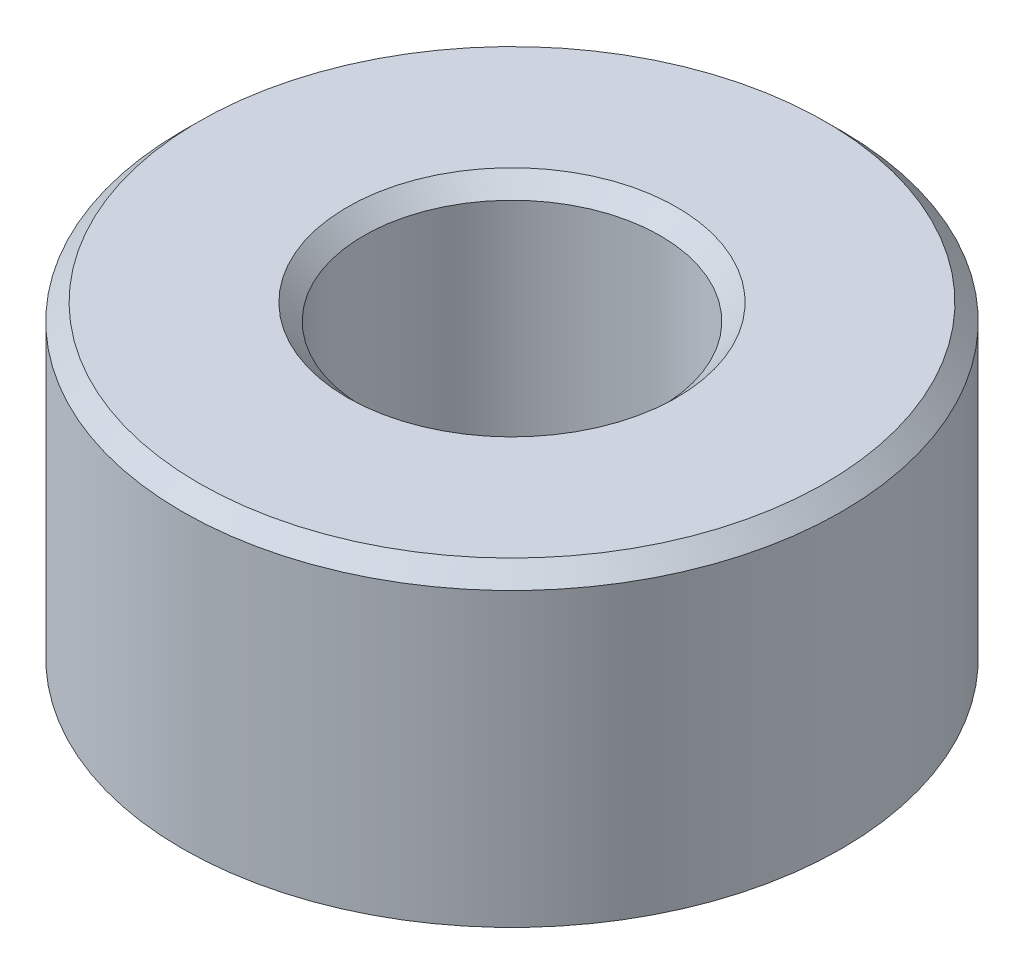
ISO-10303-21;
HEADER;
FILE_DESCRIPTION(('STEP AP214'),'2;1');
FILE_NAME('part.step','',(''),(''),'','','');
FILE_SCHEMA(('AUTOMOTIVE_DESIGN { 1 0 10303 214 1 1 1 1 }'));
ENDSEC;
DATA;
#1=APPLICATION_CONTEXT('core data for automotive mechanical design processes');
#2=APPLICATION_PROTOCOL_DEFINITION('international standard','automotive_design',2000,#1);
#3=PRODUCT_CONTEXT('',#1,'mechanical');
#4=PRODUCT('Part','Part','',(#3));
#5=PRODUCT_RELATED_PRODUCT_CATEGORY('part','',(#4));
#6=PRODUCT_DEFINITION_FORMATION('','',#4);
#7=PRODUCT_DEFINITION_CONTEXT('part definition',#1,'design');
#8=PRODUCT_DEFINITION('design','',#6,#7);
#9=PRODUCT_DEFINITION_SHAPE('','',#8);
#10=(LENGTH_UNIT() NAMED_UNIT(*) SI_UNIT(.MILLI.,.METRE.));
#11=(NAMED_UNIT(*) PLANE_ANGLE_UNIT() SI_UNIT($,.RADIAN.));
#12=(NAMED_UNIT(*) SI_UNIT($,.STERADIAN.) SOLID_ANGLE_UNIT());
#13=UNCERTAINTY_MEASURE_WITH_UNIT(LENGTH_MEASURE(1.E-05),#10,'distance_accuracy_value','');
#14=(GEOMETRIC_REPRESENTATION_CONTEXT(3) GLOBAL_UNCERTAINTY_ASSIGNED_CONTEXT((#13)) GLOBAL_UNIT_ASSIGNED_CONTEXT((#10,
#11,#12)) REPRESENTATION_CONTEXT('',''));
#15=CARTESIAN_POINT('',(0.,0.,0.));
#16=DIRECTION('',(0.,0.,1.));
#17=DIRECTION('',(1.,0.,0.));
#18=AXIS2_PLACEMENT_3D('',#15,#16,#17);
#19=CARTESIAN_POINT('',(0.,9.35,0.));
#20=DIRECTION('',(0.,1.,0.));
#21=DIRECTION('',(0.,0.,1.));
#22=AXIS2_PLACEMENT_3D('',#19,#20,#21);
#23=PLANE('',#22);
#24=CARTESIAN_POINT('',(0.,9.35,0.));
#25=DIRECTION('',(0.,1.,0.));
#26=DIRECTION('',(0.,0.,1.));
#27=AXIS2_PLACEMENT_3D('',#24,#25,#26);
#28=CIRCLE('',#27,9.50000000000001);
#29=CARTESIAN_POINT('',(0.,9.35,9.50000000000001));
#30=VERTEX_POINT('',#29);
#31=EDGE_CURVE('E45',#30,#30,#28,.T.);
#32=ORIENTED_EDGE('',*,*,#31,.T.);
#33=EDGE_LOOP('',(#32));
#34=FACE_BOUND('',#33,.T.);
#35=CARTESIAN_POINT('',(0.,9.35,0.));
#36=DIRECTION('',(0.,1.,0.));
#37=DIRECTION('',(0.,0.,1.));
#38=AXIS2_PLACEMENT_3D('',#35,#36,#37);
#39=CIRCLE('',#38,5.);
#40=CARTESIAN_POINT('',(0.,9.35,5.));
#41=VERTEX_POINT('',#40);
#42=EDGE_CURVE('E49',#41,#41,#39,.F.);
#43=ORIENTED_EDGE('',*,*,#42,.T.);
#44=EDGE_LOOP('',(#43));
#45=FACE_BOUND('',#44,.T.);
#46=ADVANCED_FACE('F34',(#34,#45),#23,.T.);
#47=CARTESIAN_POINT('',(0.,0.,0.));
#48=DIRECTION('',(0.,1.,0.));
#49=DIRECTION('',(0.,0.,1.));
#50=AXIS2_PLACEMENT_3D('',#47,#48,#49);
#51=PLANE('',#50);
#52=CARTESIAN_POINT('',(0.,0.,0.));
#53=DIRECTION('',(0.,1.,0.));
#54=DIRECTION('',(0.,0.,1.));
#55=AXIS2_PLACEMENT_3D('',#52,#53,#54);
#56=CIRCLE('',#55,10.);
#57=CARTESIAN_POINT('',(0.,0.,10.));
#58=VERTEX_POINT('',#57);
#59=EDGE_CURVE('E54',#58,#58,#56,.T.);
#60=ORIENTED_EDGE('',*,*,#59,.F.);
#61=EDGE_LOOP('',(#60));
#62=FACE_BOUND('',#61,.T.);
#63=CARTESIAN_POINT('',(0.,0.,0.));
#64=DIRECTION('',(0.,1.,0.));
#65=DIRECTION('',(0.,0.,1.));
#66=AXIS2_PLACEMENT_3D('',#63,#64,#65);
#67=CIRCLE('',#66,4.5);
#68=CARTESIAN_POINT('',(0.,0.,4.5));
#69=VERTEX_POINT('',#68);
#70=EDGE_CURVE('E57',#69,#69,#67,.T.);
#71=ORIENTED_EDGE('',*,*,#70,.T.);
#72=EDGE_LOOP('',(#71));
#73=FACE_BOUND('',#72,.T.);
#74=ADVANCED_FACE('F61',(#62,#73),#51,.F.);
#75=CARTESIAN_POINT('',(0.,9.35,0.));
#76=DIRECTION('',(0.,-1.,0.));
#77=DIRECTION('',(0.,0.,-1.));
#78=AXIS2_PLACEMENT_3D('',#75,#76,#77);
#79=CYLINDRICAL_SURFACE('',#78,10.);
#80=CARTESIAN_POINT('',(0.,8.85,0.));
#81=DIRECTION('',(0.,1.,0.));
#82=DIRECTION('',(0.,0.,1.));
#83=AXIS2_PLACEMENT_3D('',#80,#81,#82);
#84=CIRCLE('',#83,10.);
#85=CARTESIAN_POINT('',(0.,8.85,10.));
#86=VERTEX_POINT('',#85);
#87=EDGE_CURVE('E41',#86,#86,#84,.F.);
#88=ORIENTED_EDGE('',*,*,#87,.T.);
#89=EDGE_LOOP('',(#88));
#90=FACE_BOUND('',#89,.T.);
#91=ORIENTED_EDGE('',*,*,#59,.T.);
#92=EDGE_LOOP('',(#91));
#93=FACE_BOUND('',#92,.T.);
#94=ADVANCED_FACE('F66',(#90,#93),#79,.T.);
#95=CARTESIAN_POINT('',(0.,9.35,0.));
#96=DIRECTION('',(0.,-1.,0.));
#97=DIRECTION('',(0.,0.,-1.));
#98=AXIS2_PLACEMENT_3D('',#95,#96,#97);
#99=CYLINDRICAL_SURFACE('',#98,4.5);
#100=CARTESIAN_POINT('',(0.,8.84999999999999,0.));
#101=DIRECTION('',(0.,1.,0.));
#102=DIRECTION('',(0.,0.,1.));
#103=AXIS2_PLACEMENT_3D('',#100,#101,#102);
#104=CIRCLE('',#103,4.5);
#105=CARTESIAN_POINT('',(0.,8.84999999999999,4.5));
#106=VERTEX_POINT('',#105);
#107=EDGE_CURVE('E10',#106,#106,#104,.T.);
#108=ORIENTED_EDGE('',*,*,#107,.T.);
#109=EDGE_LOOP('',(#108));
#110=FACE_BOUND('',#109,.T.);
#111=ORIENTED_EDGE('',*,*,#70,.F.);
#112=EDGE_LOOP('',(#111));
#113=FACE_BOUND('',#112,.T.);
#114=ADVANCED_FACE('F63',(#110,#113),#99,.F.);
#115=CARTESIAN_POINT('',(0.,9.35,0.));
#116=DIRECTION('',(0.,-1.,0.));
#117=DIRECTION('',(0.,0.,-1.));
#118=AXIS2_PLACEMENT_3D('',#115,#116,#117);
#119=CONICAL_SURFACE('',#118,9.50000000000001,0.785398163397443);
#120=ORIENTED_EDGE('',*,*,#87,.F.);
#121=EDGE_LOOP('',(#120));
#122=FACE_BOUND('',#121,.T.);
#123=ORIENTED_EDGE('',*,*,#31,.F.);
#124=EDGE_LOOP('',(#123));
#125=FACE_BOUND('',#124,.T.);
#126=ADVANCED_FACE('F65',(#122,#125),#119,.T.);
#127=CARTESIAN_POINT('',(0.,8.84999999999999,0.));
#128=DIRECTION('',(0.,1.,0.));
#129=DIRECTION('',(0.,0.,1.));
#130=AXIS2_PLACEMENT_3D('',#127,#128,#129);
#131=CONICAL_SURFACE('',#130,4.5,0.78539816339745);
#132=ORIENTED_EDGE('',*,*,#42,.F.);
#133=EDGE_LOOP('',(#132));
#134=FACE_BOUND('',#133,.T.);
#135=ORIENTED_EDGE('',*,*,#107,.F.);
#136=EDGE_LOOP('',(#135));
#137=FACE_BOUND('',#136,.T.);
#138=ADVANCED_FACE('F36',(#134,#137),#131,.F.);
#139=CLOSED_SHELL('',(#46,#74,#94,#114,#126,#138));
#140=MANIFOLD_SOLID_BREP('B2',#139);
#141=ADVANCED_BREP_SHAPE_REPRESENTATION('',(#18,#140),#14);
#142=SHAPE_DEFINITION_REPRESENTATION(#9,#141);
ENDSEC;
END-ISO-10303-21;
